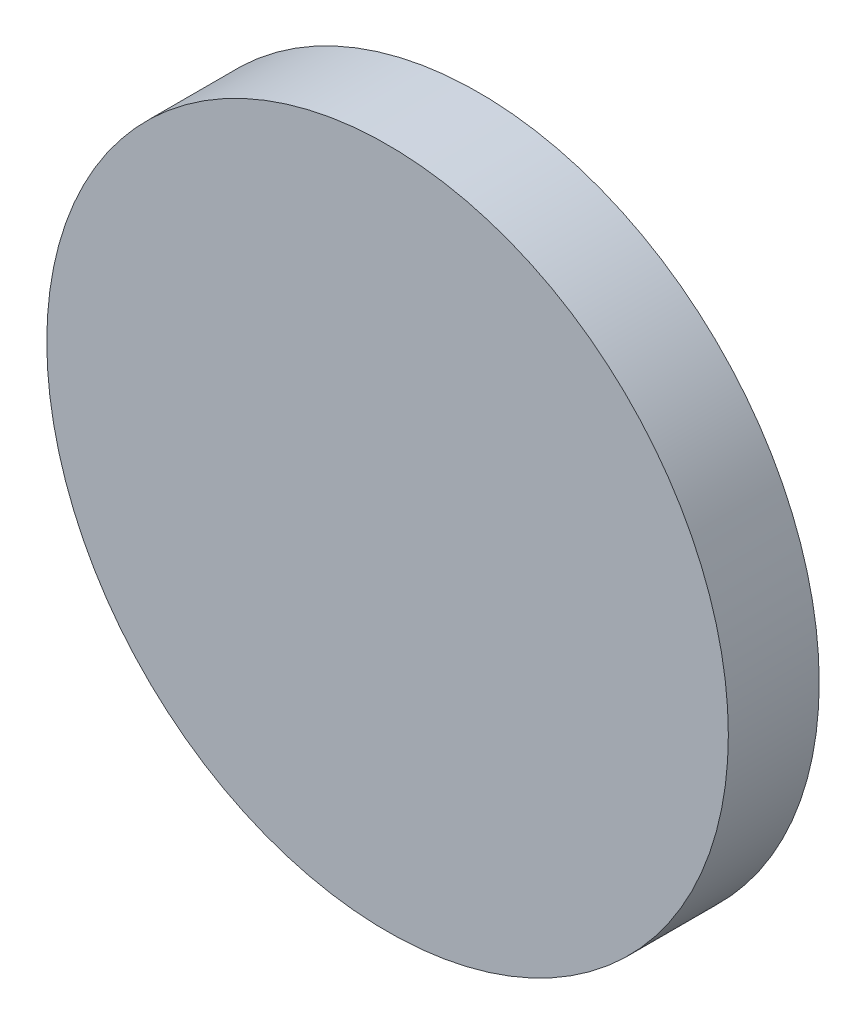
ISO-10303-21;
HEADER;
FILE_DESCRIPTION(('STEP AP214'),'2;1');
FILE_NAME('part.step','',(''),(''),'','','');
FILE_SCHEMA(('AUTOMOTIVE_DESIGN { 1 0 10303 214 1 1 1 1 }'));
ENDSEC;
DATA;
#1=APPLICATION_CONTEXT('core data for automotive mechanical design processes');
#2=APPLICATION_PROTOCOL_DEFINITION('international standard','automotive_design',2000,#1);
#3=PRODUCT_CONTEXT('',#1,'mechanical');
#4=PRODUCT('Part','Part','',(#3));
#5=PRODUCT_RELATED_PRODUCT_CATEGORY('part','',(#4));
#6=PRODUCT_DEFINITION_FORMATION('','',#4);
#7=PRODUCT_DEFINITION_CONTEXT('part definition',#1,'design');
#8=PRODUCT_DEFINITION('design','',#6,#7);
#9=PRODUCT_DEFINITION_SHAPE('','',#8);
#10=(LENGTH_UNIT() NAMED_UNIT(*) SI_UNIT(.MILLI.,.METRE.));
#11=(NAMED_UNIT(*) PLANE_ANGLE_UNIT() SI_UNIT($,.RADIAN.));
#12=(NAMED_UNIT(*) SI_UNIT($,.STERADIAN.) SOLID_ANGLE_UNIT());
#13=UNCERTAINTY_MEASURE_WITH_UNIT(LENGTH_MEASURE(1.E-05),#10,'distance_accuracy_value','');
#14=(GEOMETRIC_REPRESENTATION_CONTEXT(3) GLOBAL_UNCERTAINTY_ASSIGNED_CONTEXT((#13)) GLOBAL_UNIT_ASSIGNED_CONTEXT((#10,
#11,#12)) REPRESENTATION_CONTEXT('',''));
#15=CARTESIAN_POINT('',(0.,0.,0.));
#16=DIRECTION('',(0.,0.,1.));
#17=DIRECTION('',(1.,0.,0.));
#18=AXIS2_PLACEMENT_3D('',#15,#16,#17);
#19=CARTESIAN_POINT('',(0.,0.,50.8));
#20=DIRECTION('',(0.,0.,-1.));
#21=DIRECTION('',(-1.,0.,0.));
#22=AXIS2_PLACEMENT_3D('',#19,#20,#21);
#23=CYLINDRICAL_SURFACE('',#22,190.5);
#24=CARTESIAN_POINT('',(0.,0.,50.8));
#25=DIRECTION('',(0.,0.,1.));
#26=DIRECTION('',(1.,0.,0.));
#27=AXIS2_PLACEMENT_3D('',#24,#25,#26);
#28=CIRCLE('',#27,190.5);
#29=CARTESIAN_POINT('',(190.5,0.,50.8));
#30=VERTEX_POINT('',#29);
#31=EDGE_CURVE('E10',#30,#30,#28,.T.);
#32=ORIENTED_EDGE('',*,*,#31,.F.);
#33=EDGE_LOOP('',(#32));
#34=FACE_BOUND('',#33,.T.);
#35=CARTESIAN_POINT('',(0.,0.,0.));
#36=DIRECTION('',(0.,0.,1.));
#37=DIRECTION('',(1.,0.,0.));
#38=AXIS2_PLACEMENT_3D('',#35,#36,#37);
#39=CIRCLE('',#38,190.5);
#40=CARTESIAN_POINT('',(190.5,0.,0.));
#41=VERTEX_POINT('',#40);
#42=EDGE_CURVE('E40',#41,#41,#39,.T.);
#43=ORIENTED_EDGE('',*,*,#42,.T.);
#44=EDGE_LOOP('',(#43));
#45=FACE_BOUND('',#44,.T.);
#46=ADVANCED_FACE('F37',(#34,#45),#23,.T.);
#47=CARTESIAN_POINT('',(0.,0.,50.8));
#48=DIRECTION('',(0.,0.,1.));
#49=DIRECTION('',(1.,0.,0.));
#50=AXIS2_PLACEMENT_3D('',#47,#48,#49);
#51=PLANE('',#50);
#52=ORIENTED_EDGE('',*,*,#31,.T.);
#53=EDGE_LOOP('',(#52));
#54=FACE_BOUND('',#53,.T.);
#55=ADVANCED_FACE('F70',(#54),#51,.T.);
#56=CARTESIAN_POINT('',(0.,0.,0.));
#57=DIRECTION('',(0.,0.,1.));
#58=DIRECTION('',(1.,0.,0.));
#59=AXIS2_PLACEMENT_3D('',#56,#57,#58);
#60=PLANE('',#59);
#61=CARTESIAN_POINT('',(0.,0.,0.));
#62=DIRECTION('',(0.,0.,-1.));
#63=DIRECTION('',(-1.,0.,0.));
#64=AXIS2_PLACEMENT_3D('',#61,#62,#63);
#65=CIRCLE('',#64,63.5);
#66=CARTESIAN_POINT('',(-63.5,0.,0.));
#67=VERTEX_POINT('',#66);
#68=EDGE_CURVE('E51',#67,#67,#65,.T.);
#69=ORIENTED_EDGE('',*,*,#68,.F.);
#70=EDGE_LOOP('',(#69));
#71=FACE_BOUND('',#70,.T.);
#72=ORIENTED_EDGE('',*,*,#42,.F.);
#73=EDGE_LOOP('',(#72));
#74=FACE_BOUND('',#73,.T.);
#75=ADVANCED_FACE('F64',(#71,#74),#60,.F.);
#76=CARTESIAN_POINT('',(0.,0.,25.4));
#77=DIRECTION('',(0.,0.,-1.));
#78=DIRECTION('',(-1.,0.,0.));
#79=AXIS2_PLACEMENT_3D('',#76,#77,#78);
#80=CYLINDRICAL_SURFACE('',#79,63.5);
#81=CARTESIAN_POINT('',(0.,0.,25.4));
#82=DIRECTION('',(0.,0.,-1.));
#83=DIRECTION('',(-1.,0.,0.));
#84=AXIS2_PLACEMENT_3D('',#81,#82,#83);
#85=CIRCLE('',#84,63.5);
#86=CARTESIAN_POINT('',(-63.5,0.,25.4));
#87=VERTEX_POINT('',#86);
#88=EDGE_CURVE('E49',#87,#87,#85,.T.);
#89=ORIENTED_EDGE('',*,*,#88,.F.);
#90=EDGE_LOOP('',(#89));
#91=FACE_BOUND('',#90,.T.);
#92=ORIENTED_EDGE('',*,*,#68,.T.);
#93=EDGE_LOOP('',(#92));
#94=FACE_BOUND('',#93,.T.);
#95=ADVANCED_FACE('F61',(#91,#94),#80,.F.);
#96=CARTESIAN_POINT('',(0.,0.,25.4));
#97=DIRECTION('',(0.,0.,-1.));
#98=DIRECTION('',(-1.,0.,0.));
#99=AXIS2_PLACEMENT_3D('',#96,#97,#98);
#100=PLANE('',#99);
#101=ORIENTED_EDGE('',*,*,#88,.T.);
#102=EDGE_LOOP('',(#101));
#103=FACE_BOUND('',#102,.T.);
#104=ADVANCED_FACE('F59',(#103),#100,.T.);
#105=CLOSED_SHELL('',(#46,#55,#75,#95,#104));
#106=MANIFOLD_SOLID_BREP('B2',#105);
#107=ADVANCED_BREP_SHAPE_REPRESENTATION('',(#18,#106),#14);
#108=SHAPE_DEFINITION_REPRESENTATION(#9,#107);
ENDSEC;
END-ISO-10303-21;
